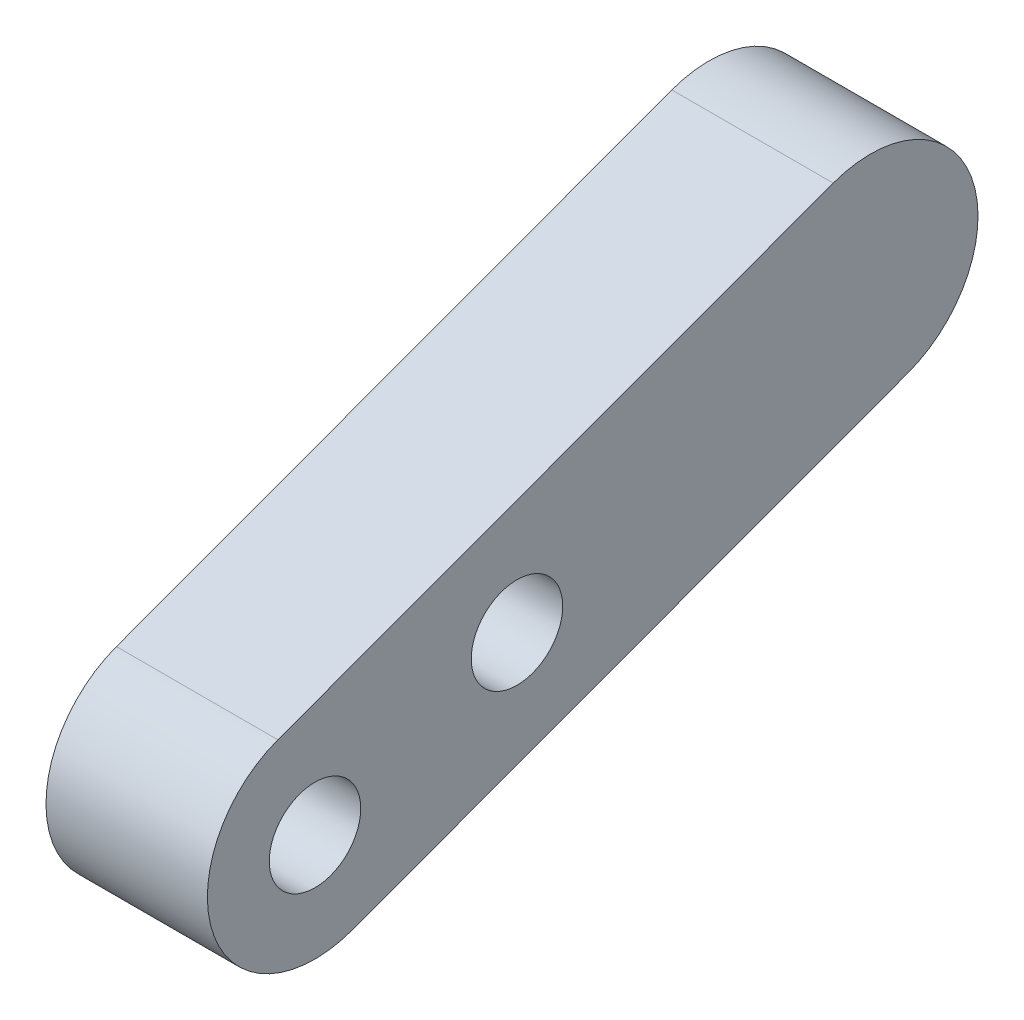
ISO-10303-21;
HEADER;
FILE_DESCRIPTION(('STEP AP214'),'2;1');
FILE_NAME('part.step','',(''),(''),'','','');
FILE_SCHEMA(('AUTOMOTIVE_DESIGN { 1 0 10303 214 1 1 1 1 }'));
ENDSEC;
DATA;
#1=APPLICATION_CONTEXT('core data for automotive mechanical design processes');
#2=APPLICATION_PROTOCOL_DEFINITION('international standard','automotive_design',2000,#1);
#3=PRODUCT_CONTEXT('',#1,'mechanical');
#4=PRODUCT('Part','Part','',(#3));
#5=PRODUCT_RELATED_PRODUCT_CATEGORY('part','',(#4));
#6=PRODUCT_DEFINITION_FORMATION('','',#4);
#7=PRODUCT_DEFINITION_CONTEXT('part definition',#1,'design');
#8=PRODUCT_DEFINITION('design','',#6,#7);
#9=PRODUCT_DEFINITION_SHAPE('','',#8);
#10=(LENGTH_UNIT() NAMED_UNIT(*) SI_UNIT(.MILLI.,.METRE.));
#11=(NAMED_UNIT(*) PLANE_ANGLE_UNIT() SI_UNIT($,.RADIAN.));
#12=(NAMED_UNIT(*) SI_UNIT($,.STERADIAN.) SOLID_ANGLE_UNIT());
#13=UNCERTAINTY_MEASURE_WITH_UNIT(LENGTH_MEASURE(1.E-05),#10,'distance_accuracy_value','');
#14=(GEOMETRIC_REPRESENTATION_CONTEXT(3) GLOBAL_UNCERTAINTY_ASSIGNED_CONTEXT((#13)) GLOBAL_UNIT_ASSIGNED_CONTEXT((#10,
#11,#12)) REPRESENTATION_CONTEXT('',''));
#15=CARTESIAN_POINT('',(0.,0.,0.));
#16=DIRECTION('',(0.,0.,1.));
#17=DIRECTION('',(1.,0.,0.));
#18=AXIS2_PLACEMENT_3D('',#15,#16,#17);
#19=CARTESIAN_POINT('',(-6.,4.83491399693388,-13.1386303183495));
#20=DIRECTION('',(1.,0.,0.));
#21=DIRECTION('',(0.,0.,-1.));
#22=AXIS2_PLACEMENT_3D('',#19,#20,#21);
#23=CYLINDRICAL_SURFACE('',#22,3.99999999999999);
#24=CARTESIAN_POINT('',(0.,4.83491399693388,-13.1386303183495));
#25=DIRECTION('',(1.,0.,0.));
#26=DIRECTION('',(0.,0.,-1.));
#27=AXIS2_PLACEMENT_3D('',#24,#25,#26);
#28=CIRCLE('',#27,3.99999999999999);
#29=CARTESIAN_POINT('',(0.,1.0810196202626,-14.5200343174735));
#30=VERTEX_POINT('',#29);
#31=CARTESIAN_POINT('',(0.,8.58880837360517,-11.7572263192255));
#32=VERTEX_POINT('',#31);
#33=EDGE_CURVE('E98',#30,#32,#28,.T.);
#34=ORIENTED_EDGE('',*,*,#33,.F.);
#35=DIRECTION('',(1.,0.,0.));
#36=VECTOR('',#35,1.);
#37=CARTESIAN_POINT('',(-6.,1.0810196202626,-14.5200343174735));
#38=LINE('',#37,#36);
#39=CARTESIAN_POINT('',(-6.,1.0810196202626,-14.5200343174735));
#40=VERTEX_POINT('',#39);
#41=EDGE_CURVE('E11',#40,#30,#38,.T.);
#42=ORIENTED_EDGE('',*,*,#41,.F.);
#43=CARTESIAN_POINT('',(-6.,4.83491399693388,-13.1386303183495));
#44=DIRECTION('',(1.,0.,0.));
#45=DIRECTION('',(0.,0.,-1.));
#46=AXIS2_PLACEMENT_3D('',#43,#44,#45);
#47=CIRCLE('',#46,3.99999999999999);
#48=CARTESIAN_POINT('',(-6.,8.58880837360517,-11.7572263192255));
#49=VERTEX_POINT('',#48);
#50=EDGE_CURVE('E91',#40,#49,#47,.T.);
#51=ORIENTED_EDGE('',*,*,#50,.T.);
#52=DIRECTION('',(1.,0.,0.));
#53=VECTOR('',#52,1.);
#54=CARTESIAN_POINT('',(-6.,8.58880837360517,-11.7572263192255));
#55=LINE('',#54,#53);
#56=EDGE_CURVE('E36',#49,#32,#55,.T.);
#57=ORIENTED_EDGE('',*,*,#56,.T.);
#58=EDGE_LOOP('',(#34,#42,#51,#57));
#59=FACE_BOUND('',#58,.T.);
#60=ADVANCED_FACE('F33',(#59),#23,.T.);
#61=CARTESIAN_POINT('',(-6.,1.0810196202626,-14.5200343174735));
#62=DIRECTION('',(0.,-0.938473594167822,-0.345350999780992));
#63=DIRECTION('',(0.,0.345350999780992,-0.938473594167822));
#64=AXIS2_PLACEMENT_3D('',#61,#62,#63);
#65=PLANE('',#64);
#66=DIRECTION('',(0.,0.345350999780992,-0.938473594167822));
#67=VECTOR('',#66,1.);
#68=CARTESIAN_POINT('',(0.,1.0810196202626,-14.5200343174735));
#69=LINE('',#68,#67);
#70=CARTESIAN_POINT('',(0.,-6.51670237491922,6.12638475421861));
#71=VERTEX_POINT('',#70);
#72=EDGE_CURVE('E93',#71,#30,#69,.T.);
#73=ORIENTED_EDGE('',*,*,#72,.F.);
#74=DIRECTION('',(1.,0.,0.));
#75=VECTOR('',#74,1.);
#76=CARTESIAN_POINT('',(-6.,-6.51670237491922,6.12638475421861));
#77=LINE('',#76,#75);
#78=CARTESIAN_POINT('',(-6.,-6.51670237491922,6.12638475421861));
#79=VERTEX_POINT('',#78);
#80=EDGE_CURVE('E42',#79,#71,#77,.T.);
#81=ORIENTED_EDGE('',*,*,#80,.F.);
#82=DIRECTION('',(0.,0.345350999780992,-0.938473594167822));
#83=VECTOR('',#82,1.);
#84=CARTESIAN_POINT('',(-6.,1.0810196202626,-14.5200343174735));
#85=LINE('',#84,#83);
#86=EDGE_CURVE('E88',#79,#40,#85,.T.);
#87=ORIENTED_EDGE('',*,*,#86,.T.);
#88=ORIENTED_EDGE('',*,*,#41,.T.);
#89=EDGE_LOOP('',(#73,#81,#87,#88));
#90=FACE_BOUND('',#89,.T.);
#91=ADVANCED_FACE('F109',(#90),#65,.T.);
#92=CARTESIAN_POINT('',(-6.,-2.76280799824793,7.50778875334258));
#93=DIRECTION('',(1.,0.,0.));
#94=DIRECTION('',(0.,0.,-1.));
#95=AXIS2_PLACEMENT_3D('',#92,#93,#94);
#96=CYLINDRICAL_SURFACE('',#95,4.);
#97=CARTESIAN_POINT('',(0.,-2.76280799824793,7.50778875334258));
#98=DIRECTION('',(1.,0.,0.));
#99=DIRECTION('',(0.,0.,-1.));
#100=AXIS2_PLACEMENT_3D('',#97,#98,#99);
#101=CIRCLE('',#100,4.);
#102=CARTESIAN_POINT('',(0.,0.991086378423351,8.88919275246654));
#103=VERTEX_POINT('',#102);
#104=EDGE_CURVE('E83',#103,#71,#101,.T.);
#105=ORIENTED_EDGE('',*,*,#104,.F.);
#106=DIRECTION('',(1.,0.,0.));
#107=VECTOR('',#106,1.);
#108=CARTESIAN_POINT('',(-6.,0.991086378423351,8.88919275246654));
#109=LINE('',#108,#107);
#110=CARTESIAN_POINT('',(-6.,0.991086378423351,8.88919275246654));
#111=VERTEX_POINT('',#110);
#112=EDGE_CURVE('E78',#111,#103,#109,.T.);
#113=ORIENTED_EDGE('',*,*,#112,.F.);
#114=CARTESIAN_POINT('',(-6.,-2.76280799824793,7.50778875334258));
#115=DIRECTION('',(1.,0.,0.));
#116=DIRECTION('',(0.,0.,-1.));
#117=AXIS2_PLACEMENT_3D('',#114,#115,#116);
#118=CIRCLE('',#117,4.);
#119=EDGE_CURVE('E81',#111,#79,#118,.T.);
#120=ORIENTED_EDGE('',*,*,#119,.T.);
#121=ORIENTED_EDGE('',*,*,#80,.T.);
#122=EDGE_LOOP('',(#105,#113,#120,#121));
#123=FACE_BOUND('',#122,.T.);
#124=ADVANCED_FACE('F80',(#123),#96,.T.);
#125=CARTESIAN_POINT('',(-6.,8.58880837360517,-11.7572263192255));
#126=DIRECTION('',(0.,0.938473594167822,0.345350999780991));
#127=DIRECTION('',(0.,-0.345350999780991,0.938473594167822));
#128=AXIS2_PLACEMENT_3D('',#125,#126,#127);
#129=PLANE('',#128);
#130=DIRECTION('',(0.,-0.345350999780992,0.938473594167822));
#131=VECTOR('',#130,1.);
#132=CARTESIAN_POINT('',(0.,8.58880837360517,-11.7572263192255));
#133=LINE('',#132,#131);
#134=EDGE_CURVE('E101',#32,#103,#133,.T.);
#135=ORIENTED_EDGE('',*,*,#134,.F.);
#136=ORIENTED_EDGE('',*,*,#56,.F.);
#137=DIRECTION('',(0.,-0.345350999780992,0.938473594167822));
#138=VECTOR('',#137,1.);
#139=CARTESIAN_POINT('',(-6.,8.58880837360517,-11.7572263192255));
#140=LINE('',#139,#138);
#141=EDGE_CURVE('E87',#49,#111,#140,.T.);
#142=ORIENTED_EDGE('',*,*,#141,.T.);
#143=ORIENTED_EDGE('',*,*,#112,.T.);
#144=EDGE_LOOP('',(#135,#136,#142,#143));
#145=FACE_BOUND('',#144,.T.);
#146=ADVANCED_FACE('F90',(#145),#129,.T.);
#147=CARTESIAN_POINT('',(-6.,4.83491399693388,-13.1386303183495));
#148=DIRECTION('',(1.,0.,0.));
#149=DIRECTION('',(0.,0.,-1.));
#150=AXIS2_PLACEMENT_3D('',#147,#148,#149);
#151=PLANE('',#150);
#152=CARTESIAN_POINT('',(-6.,-2.76280799824793,7.50778875334258));
#153=DIRECTION('',(1.,0.,0.));
#154=DIRECTION('',(0.,0.,-1.));
#155=AXIS2_PLACEMENT_3D('',#152,#153,#154);
#156=CIRCLE('',#155,1.7);
#157=CARTESIAN_POINT('',(-6.,-2.76280799824793,5.80778875334258));
#158=VERTEX_POINT('',#157);
#159=EDGE_CURVE('E142',#158,#158,#156,.T.);
#160=ORIENTED_EDGE('',*,*,#159,.T.);
#161=EDGE_LOOP('',(#160));
#162=FACE_BOUND('',#161,.T.);
#163=CARTESIAN_POINT('',(-6.,0.,0.));
#164=DIRECTION('',(1.,0.,0.));
#165=DIRECTION('',(0.,0.,-1.));
#166=AXIS2_PLACEMENT_3D('',#163,#164,#165);
#167=CIRCLE('',#166,1.7);
#168=CARTESIAN_POINT('',(-6.,0.,-1.7));
#169=VERTEX_POINT('',#168);
#170=EDGE_CURVE('E102',#169,#169,#167,.T.);
#171=ORIENTED_EDGE('',*,*,#170,.T.);
#172=EDGE_LOOP('',(#171));
#173=FACE_BOUND('',#172,.T.);
#174=ORIENTED_EDGE('',*,*,#50,.F.);
#175=ORIENTED_EDGE('',*,*,#86,.F.);
#176=ORIENTED_EDGE('',*,*,#119,.F.);
#177=ORIENTED_EDGE('',*,*,#141,.F.);
#178=EDGE_LOOP('',(#174,#175,#176,#177));
#179=FACE_BOUND('',#178,.T.);
#180=ADVANCED_FACE('F86',(#162,#173,#179),#151,.F.);
#181=CARTESIAN_POINT('',(0.,4.83491399693388,-13.1386303183495));
#182=DIRECTION('',(1.,0.,0.));
#183=DIRECTION('',(0.,0.,-1.));
#184=AXIS2_PLACEMENT_3D('',#181,#182,#183);
#185=PLANE('',#184);
#186=CARTESIAN_POINT('',(0.,-2.76280799824793,7.50778875334258));
#187=DIRECTION('',(1.,0.,0.));
#188=DIRECTION('',(0.,0.,-1.));
#189=AXIS2_PLACEMENT_3D('',#186,#187,#188);
#190=CIRCLE('',#189,1.7);
#191=CARTESIAN_POINT('',(0.,-2.76280799824793,5.80778875334258));
#192=VERTEX_POINT('',#191);
#193=EDGE_CURVE('E145',#192,#192,#190,.T.);
#194=ORIENTED_EDGE('',*,*,#193,.F.);
#195=EDGE_LOOP('',(#194));
#196=FACE_BOUND('',#195,.T.);
#197=CARTESIAN_POINT('',(0.,0.,0.));
#198=DIRECTION('',(1.,0.,0.));
#199=DIRECTION('',(0.,0.,-1.));
#200=AXIS2_PLACEMENT_3D('',#197,#198,#199);
#201=CIRCLE('',#200,1.7);
#202=CARTESIAN_POINT('',(0.,0.,-1.7));
#203=VERTEX_POINT('',#202);
#204=EDGE_CURVE('E147',#203,#203,#201,.T.);
#205=ORIENTED_EDGE('',*,*,#204,.F.);
#206=EDGE_LOOP('',(#205));
#207=FACE_BOUND('',#206,.T.);
#208=ORIENTED_EDGE('',*,*,#33,.T.);
#209=ORIENTED_EDGE('',*,*,#134,.T.);
#210=ORIENTED_EDGE('',*,*,#104,.T.);
#211=ORIENTED_EDGE('',*,*,#72,.T.);
#212=EDGE_LOOP('',(#208,#209,#210,#211));
#213=FACE_BOUND('',#212,.T.);
#214=ADVANCED_FACE('F108',(#196,#207,#213),#185,.T.);
#215=CARTESIAN_POINT('',(-6.,0.,0.));
#216=DIRECTION('',(1.,0.,0.));
#217=DIRECTION('',(0.,0.,-1.));
#218=AXIS2_PLACEMENT_3D('',#215,#216,#217);
#219=CYLINDRICAL_SURFACE('',#218,1.7);
#220=ORIENTED_EDGE('',*,*,#170,.F.);
#221=EDGE_LOOP('',(#220));
#222=FACE_BOUND('',#221,.T.);
#223=ORIENTED_EDGE('',*,*,#204,.T.);
#224=EDGE_LOOP('',(#223));
#225=FACE_BOUND('',#224,.T.);
#226=ADVANCED_FACE('F127',(#222,#225),#219,.F.);
#227=CARTESIAN_POINT('',(-6.,-2.76280799824793,7.50778875334258));
#228=DIRECTION('',(1.,0.,0.));
#229=DIRECTION('',(0.,0.,-1.));
#230=AXIS2_PLACEMENT_3D('',#227,#228,#229);
#231=CYLINDRICAL_SURFACE('',#230,1.7);
#232=ORIENTED_EDGE('',*,*,#159,.F.);
#233=EDGE_LOOP('',(#232));
#234=FACE_BOUND('',#233,.T.);
#235=ORIENTED_EDGE('',*,*,#193,.T.);
#236=EDGE_LOOP('',(#235));
#237=FACE_BOUND('',#236,.T.);
#238=ADVANCED_FACE('F134',(#234,#237),#231,.F.);
#239=CLOSED_SHELL('',(#60,#91,#124,#146,#180,#214,#226,#238));
#240=MANIFOLD_SOLID_BREP('B2',#239);
#241=ADVANCED_BREP_SHAPE_REPRESENTATION('',(#18,#240),#14);
#242=SHAPE_DEFINITION_REPRESENTATION(#9,#241);
ENDSEC;
END-ISO-10303-21;
